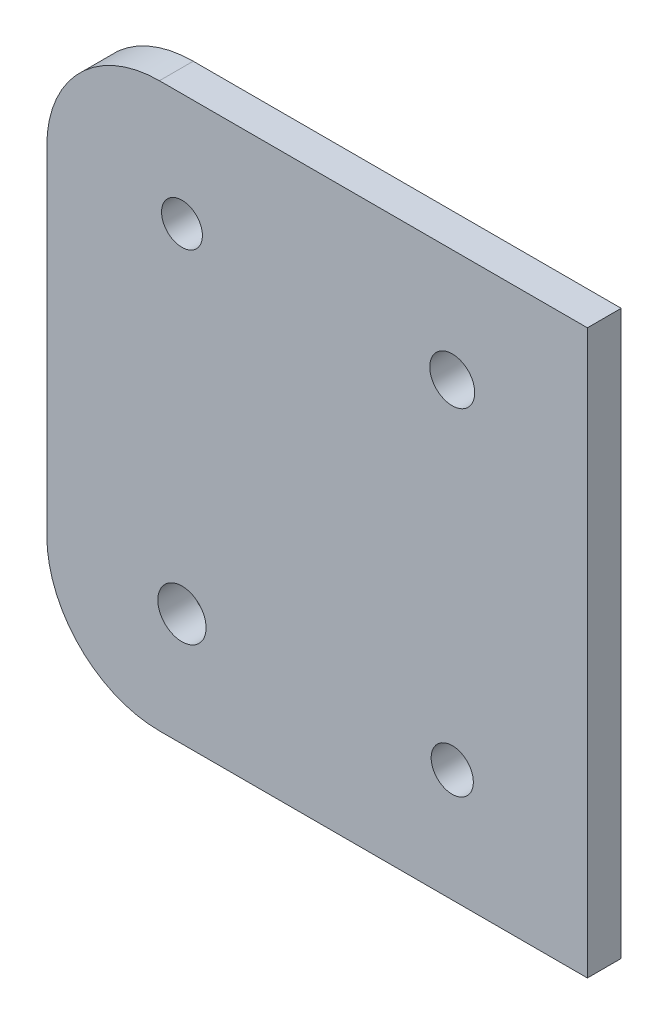
ISO-10303-21;
HEADER;
FILE_DESCRIPTION(('STEP AP214'),'2;1');
FILE_NAME('part.step','',(''),(''),'','','');
FILE_SCHEMA(('AUTOMOTIVE_DESIGN { 1 0 10303 214 1 1 1 1 }'));
ENDSEC;
DATA;
#1=APPLICATION_CONTEXT('core data for automotive mechanical design processes');
#2=APPLICATION_PROTOCOL_DEFINITION('international standard','automotive_design',2000,#1);
#3=PRODUCT_CONTEXT('',#1,'mechanical');
#4=PRODUCT('Part','Part','',(#3));
#5=PRODUCT_RELATED_PRODUCT_CATEGORY('part','',(#4));
#6=PRODUCT_DEFINITION_FORMATION('','',#4);
#7=PRODUCT_DEFINITION_CONTEXT('part definition',#1,'design');
#8=PRODUCT_DEFINITION('design','',#6,#7);
#9=PRODUCT_DEFINITION_SHAPE('','',#8);
#10=(LENGTH_UNIT() NAMED_UNIT(*) SI_UNIT(.MILLI.,.METRE.));
#11=(NAMED_UNIT(*) PLANE_ANGLE_UNIT() SI_UNIT($,.RADIAN.));
#12=(NAMED_UNIT(*) SI_UNIT($,.STERADIAN.) SOLID_ANGLE_UNIT());
#13=UNCERTAINTY_MEASURE_WITH_UNIT(LENGTH_MEASURE(1.E-05),#10,'distance_accuracy_value','');
#14=(GEOMETRIC_REPRESENTATION_CONTEXT(3) GLOBAL_UNCERTAINTY_ASSIGNED_CONTEXT((#13)) GLOBAL_UNIT_ASSIGNED_CONTEXT((#10,
#11,#12)) REPRESENTATION_CONTEXT('',''));
#15=CARTESIAN_POINT('',(0.,0.,0.));
#16=DIRECTION('',(0.,0.,1.));
#17=DIRECTION('',(1.,0.,0.));
#18=AXIS2_PLACEMENT_3D('',#15,#16,#17);
#19=CARTESIAN_POINT('',(-13.3246753246753,-25.3766233766234,3.));
#20=DIRECTION('',(0.,0.,-1.));
#21=DIRECTION('',(-1.,0.,0.));
#22=AXIS2_PLACEMENT_3D('',#19,#20,#21);
#23=PLANE('',#22);
#24=DIRECTION('',(0.,1.,0.));
#25=VECTOR('',#24,1.);
#26=CARTESIAN_POINT('',(24.6753246753247,14.6233766233766,3.));
#27=LINE('',#26,#25);
#28=CARTESIAN_POINT('',(24.6753246753247,-35.3766233766234,3.));
#29=VERTEX_POINT('',#28);
#30=CARTESIAN_POINT('',(24.6753246753247,14.6233766233766,3.));
#31=VERTEX_POINT('',#30);
#32=EDGE_CURVE('E128',#29,#31,#27,.T.);
#33=ORIENTED_EDGE('',*,*,#32,.T.);
#34=DIRECTION('',(-1.,0.,0.));
#35=VECTOR('',#34,1.);
#36=CARTESIAN_POINT('',(-13.3246753246753,14.6233766233766,3.));
#37=LINE('',#36,#35);
#38=CARTESIAN_POINT('',(-13.3246753246753,14.6233766233766,3.));
#39=VERTEX_POINT('',#38);
#40=EDGE_CURVE('E86',#31,#39,#37,.T.);
#41=ORIENTED_EDGE('',*,*,#40,.T.);
#42=CARTESIAN_POINT('',(-13.3246753246753,4.62337662337662,3.));
#43=DIRECTION('',(0.,0.,1.));
#44=DIRECTION('',(-1.,0.,0.));
#45=AXIS2_PLACEMENT_3D('',#42,#43,#44);
#46=CIRCLE('',#45,10.);
#47=CARTESIAN_POINT('',(-23.3246753246753,4.62337662337655,3.));
#48=VERTEX_POINT('',#47);
#49=EDGE_CURVE('E99',#39,#48,#46,.T.);
#50=ORIENTED_EDGE('',*,*,#49,.T.);
#51=DIRECTION('',(0.,-1.,0.));
#52=VECTOR('',#51,1.);
#53=CARTESIAN_POINT('',(-23.3246753246753,4.62337662337655,3.));
#54=LINE('',#53,#52);
#55=CARTESIAN_POINT('',(-23.3246753246753,-25.3766233766234,3.));
#56=VERTEX_POINT('',#55);
#57=EDGE_CURVE('E93',#48,#56,#54,.T.);
#58=ORIENTED_EDGE('',*,*,#57,.T.);
#59=CARTESIAN_POINT('',(-13.3246753246753,-25.3766233766234,3.));
#60=DIRECTION('',(0.,0.,1.));
#61=DIRECTION('',(-1.,0.,0.));
#62=AXIS2_PLACEMENT_3D('',#59,#60,#61);
#63=CIRCLE('',#62,10.);
#64=CARTESIAN_POINT('',(-13.3246753246753,-35.3766233766234,3.));
#65=VERTEX_POINT('',#64);
#66=EDGE_CURVE('E97',#56,#65,#63,.T.);
#67=ORIENTED_EDGE('',*,*,#66,.T.);
#68=DIRECTION('',(1.,0.,0.));
#69=VECTOR('',#68,1.);
#70=CARTESIAN_POINT('',(-13.3246753246753,-35.3766233766234,3.));
#71=LINE('',#70,#69);
#72=EDGE_CURVE('E49',#65,#29,#71,.T.);
#73=ORIENTED_EDGE('',*,*,#72,.T.);
#74=EDGE_LOOP('',(#33,#41,#50,#58,#67,#73));
#75=FACE_BOUND('',#74,.T.);
#76=CARTESIAN_POINT('',(-11.3246753246753,4.62337662337662,3.));
#77=DIRECTION('',(0.,0.,1.));
#78=DIRECTION('',(1.,0.,0.));
#79=AXIS2_PLACEMENT_3D('',#76,#77,#78);
#80=CIRCLE('',#79,1.8144674489946);
#81=CARTESIAN_POINT('',(-9.51020787568073,4.62337662337662,3.));
#82=VERTEX_POINT('',#81);
#83=EDGE_CURVE('E121',#82,#82,#80,.T.);
#84=ORIENTED_EDGE('',*,*,#83,.F.);
#85=EDGE_LOOP('',(#84));
#86=FACE_BOUND('',#85,.T.);
#87=CARTESIAN_POINT('',(12.6753246753247,4.62337662337662,3.));
#88=DIRECTION('',(0.,0.,1.));
#89=DIRECTION('',(1.,0.,0.));
#90=AXIS2_PLACEMENT_3D('',#87,#88,#89);
#91=CIRCLE('',#90,1.99577898309595);
#92=CARTESIAN_POINT('',(14.6711036584206,4.62337662337662,3.));
#93=VERTEX_POINT('',#92);
#94=EDGE_CURVE('E192',#93,#93,#91,.T.);
#95=ORIENTED_EDGE('',*,*,#94,.F.);
#96=EDGE_LOOP('',(#95));
#97=FACE_BOUND('',#96,.T.);
#98=CARTESIAN_POINT('',(-11.3246753246753,-25.3766233766234,3.));
#99=DIRECTION('',(0.,0.,1.));
#100=DIRECTION('',(1.,0.,0.));
#101=AXIS2_PLACEMENT_3D('',#98,#99,#100);
#102=CIRCLE('',#101,2.14187305226892);
#103=CARTESIAN_POINT('',(-9.18280227240641,-25.3766233766234,3.));
#104=VERTEX_POINT('',#103);
#105=EDGE_CURVE('E186',#104,#104,#102,.T.);
#106=ORIENTED_EDGE('',*,*,#105,.F.);
#107=EDGE_LOOP('',(#106));
#108=FACE_BOUND('',#107,.T.);
#109=CARTESIAN_POINT('',(12.6753246753247,-25.3766233766234,3.));
#110=DIRECTION('',(0.,0.,1.));
#111=DIRECTION('',(1.,0.,0.));
#112=AXIS2_PLACEMENT_3D('',#109,#110,#111);
#113=CIRCLE('',#112,1.87301364959167);
#114=CARTESIAN_POINT('',(14.5483383249163,-25.3766233766234,3.));
#115=VERTEX_POINT('',#114);
#116=EDGE_CURVE('E177',#115,#115,#113,.T.);
#117=ORIENTED_EDGE('',*,*,#116,.F.);
#118=EDGE_LOOP('',(#117));
#119=FACE_BOUND('',#118,.T.);
#120=ADVANCED_FACE('F32',(#75,#86,#97,#108,#119),#23,.F.);
#121=CARTESIAN_POINT('',(-13.3246753246753,-25.3766233766234,0.));
#122=DIRECTION('',(0.,0.,-1.));
#123=DIRECTION('',(-1.,0.,0.));
#124=AXIS2_PLACEMENT_3D('',#121,#122,#123);
#125=PLANE('',#124);
#126=CARTESIAN_POINT('',(-11.3246753246753,-25.3766233766234,0.));
#127=DIRECTION('',(0.,0.,1.));
#128=DIRECTION('',(1.,0.,0.));
#129=AXIS2_PLACEMENT_3D('',#126,#127,#128);
#130=CIRCLE('',#129,2.14187305226892);
#131=CARTESIAN_POINT('',(-9.18280227240641,-25.3766233766234,0.));
#132=VERTEX_POINT('',#131);
#133=EDGE_CURVE('E183',#132,#132,#130,.T.);
#134=ORIENTED_EDGE('',*,*,#133,.T.);
#135=EDGE_LOOP('',(#134));
#136=FACE_BOUND('',#135,.T.);
#137=CARTESIAN_POINT('',(-11.3246753246753,4.62337662337662,0.));
#138=DIRECTION('',(0.,0.,1.));
#139=DIRECTION('',(1.,0.,0.));
#140=AXIS2_PLACEMENT_3D('',#137,#138,#139);
#141=CIRCLE('',#140,1.8144674489946);
#142=CARTESIAN_POINT('',(-9.51020787568073,4.62337662337662,0.));
#143=VERTEX_POINT('',#142);
#144=EDGE_CURVE('E195',#143,#143,#141,.T.);
#145=ORIENTED_EDGE('',*,*,#144,.T.);
#146=EDGE_LOOP('',(#145));
#147=FACE_BOUND('',#146,.T.);
#148=DIRECTION('',(0.,1.,0.));
#149=VECTOR('',#148,1.);
#150=CARTESIAN_POINT('',(24.6753246753247,14.6233766233766,0.));
#151=LINE('',#150,#149);
#152=CARTESIAN_POINT('',(24.6753246753247,-35.3766233766234,0.));
#153=VERTEX_POINT('',#152);
#154=CARTESIAN_POINT('',(24.6753246753247,14.6233766233766,0.));
#155=VERTEX_POINT('',#154);
#156=EDGE_CURVE('E117',#153,#155,#151,.T.);
#157=ORIENTED_EDGE('',*,*,#156,.F.);
#158=DIRECTION('',(1.,0.,0.));
#159=VECTOR('',#158,1.);
#160=CARTESIAN_POINT('',(-13.3246753246753,-35.3766233766234,0.));
#161=LINE('',#160,#159);
#162=CARTESIAN_POINT('',(-13.3246753246753,-35.3766233766234,0.));
#163=VERTEX_POINT('',#162);
#164=EDGE_CURVE('E78',#163,#153,#161,.T.);
#165=ORIENTED_EDGE('',*,*,#164,.F.);
#166=CARTESIAN_POINT('',(-13.3246753246753,-25.3766233766234,0.));
#167=DIRECTION('',(0.,0.,1.));
#168=DIRECTION('',(-1.,0.,0.));
#169=AXIS2_PLACEMENT_3D('',#166,#167,#168);
#170=CIRCLE('',#169,10.);
#171=CARTESIAN_POINT('',(-23.3246753246753,-25.3766233766234,0.));
#172=VERTEX_POINT('',#171);
#173=EDGE_CURVE('E72',#172,#163,#170,.T.);
#174=ORIENTED_EDGE('',*,*,#173,.F.);
#175=DIRECTION('',(0.,-1.,0.));
#176=VECTOR('',#175,1.);
#177=CARTESIAN_POINT('',(-23.3246753246753,4.62337662337655,0.));
#178=LINE('',#177,#176);
#179=CARTESIAN_POINT('',(-23.3246753246753,4.62337662337655,0.));
#180=VERTEX_POINT('',#179);
#181=EDGE_CURVE('E107',#180,#172,#178,.T.);
#182=ORIENTED_EDGE('',*,*,#181,.F.);
#183=CARTESIAN_POINT('',(-13.3246753246753,4.62337662337662,0.));
#184=DIRECTION('',(0.,0.,1.));
#185=DIRECTION('',(-1.,0.,0.));
#186=AXIS2_PLACEMENT_3D('',#183,#184,#185);
#187=CIRCLE('',#186,10.);
#188=CARTESIAN_POINT('',(-13.3246753246753,14.6233766233766,0.));
#189=VERTEX_POINT('',#188);
#190=EDGE_CURVE('E123',#189,#180,#187,.T.);
#191=ORIENTED_EDGE('',*,*,#190,.F.);
#192=DIRECTION('',(-1.,0.,0.));
#193=VECTOR('',#192,1.);
#194=CARTESIAN_POINT('',(-13.3246753246753,14.6233766233766,0.));
#195=LINE('',#194,#193);
#196=EDGE_CURVE('E120',#155,#189,#195,.T.);
#197=ORIENTED_EDGE('',*,*,#196,.F.);
#198=EDGE_LOOP('',(#157,#165,#174,#182,#191,#197));
#199=FACE_BOUND('',#198,.T.);
#200=CARTESIAN_POINT('',(12.6753246753247,4.62337662337662,0.));
#201=DIRECTION('',(0.,0.,1.));
#202=DIRECTION('',(1.,0.,0.));
#203=AXIS2_PLACEMENT_3D('',#200,#201,#202);
#204=CIRCLE('',#203,1.99577898309595);
#205=CARTESIAN_POINT('',(14.6711036584206,4.62337662337662,0.));
#206=VERTEX_POINT('',#205);
#207=EDGE_CURVE('E189',#206,#206,#204,.T.);
#208=ORIENTED_EDGE('',*,*,#207,.T.);
#209=EDGE_LOOP('',(#208));
#210=FACE_BOUND('',#209,.T.);
#211=CARTESIAN_POINT('',(12.6753246753247,-25.3766233766234,0.));
#212=DIRECTION('',(0.,0.,1.));
#213=DIRECTION('',(1.,0.,0.));
#214=AXIS2_PLACEMENT_3D('',#211,#212,#213);
#215=CIRCLE('',#214,1.87301364959167);
#216=CARTESIAN_POINT('',(14.5483383249163,-25.3766233766234,0.));
#217=VERTEX_POINT('',#216);
#218=EDGE_CURVE('E180',#217,#217,#215,.T.);
#219=ORIENTED_EDGE('',*,*,#218,.T.);
#220=EDGE_LOOP('',(#219));
#221=FACE_BOUND('',#220,.T.);
#222=ADVANCED_FACE('F137',(#136,#147,#199,#210,#221),#125,.T.);
#223=CARTESIAN_POINT('',(24.6753246753247,14.6233766233766,3.));
#224=DIRECTION('',(-1.,0.,0.));
#225=DIRECTION('',(0.,-1.,0.));
#226=AXIS2_PLACEMENT_3D('',#223,#224,#225);
#227=PLANE('',#226);
#228=ORIENTED_EDGE('',*,*,#156,.T.);
#229=DIRECTION('',(0.,0.,-1.));
#230=VECTOR('',#229,1.);
#231=CARTESIAN_POINT('',(24.6753246753247,14.6233766233766,3.));
#232=LINE('',#231,#230);
#233=EDGE_CURVE('E11',#31,#155,#232,.T.);
#234=ORIENTED_EDGE('',*,*,#233,.F.);
#235=ORIENTED_EDGE('',*,*,#32,.F.);
#236=DIRECTION('',(0.,0.,-1.));
#237=VECTOR('',#236,1.);
#238=CARTESIAN_POINT('',(24.6753246753247,-35.3766233766234,3.));
#239=LINE('',#238,#237);
#240=EDGE_CURVE('E113',#29,#153,#239,.T.);
#241=ORIENTED_EDGE('',*,*,#240,.T.);
#242=EDGE_LOOP('',(#228,#234,#235,#241));
#243=FACE_BOUND('',#242,.T.);
#244=ADVANCED_FACE('F34',(#243),#227,.F.);
#245=CARTESIAN_POINT('',(-13.3246753246753,14.6233766233766,3.));
#246=DIRECTION('',(0.,-1.,0.));
#247=DIRECTION('',(0.,0.,-1.));
#248=AXIS2_PLACEMENT_3D('',#245,#246,#247);
#249=PLANE('',#248);
#250=ORIENTED_EDGE('',*,*,#196,.T.);
#251=DIRECTION('',(0.,0.,-1.));
#252=VECTOR('',#251,1.);
#253=CARTESIAN_POINT('',(-13.3246753246753,14.6233766233766,3.));
#254=LINE('',#253,#252);
#255=EDGE_CURVE('E41',#39,#189,#254,.T.);
#256=ORIENTED_EDGE('',*,*,#255,.F.);
#257=ORIENTED_EDGE('',*,*,#40,.F.);
#258=ORIENTED_EDGE('',*,*,#233,.T.);
#259=EDGE_LOOP('',(#250,#256,#257,#258));
#260=FACE_BOUND('',#259,.T.);
#261=ADVANCED_FACE('F255',(#260),#249,.F.);
#262=CARTESIAN_POINT('',(-13.3246753246753,4.62337662337662,3.));
#263=DIRECTION('',(0.,0.,-1.));
#264=DIRECTION('',(-1.,0.,0.));
#265=AXIS2_PLACEMENT_3D('',#262,#263,#264);
#266=CYLINDRICAL_SURFACE('',#265,10.);
#267=ORIENTED_EDGE('',*,*,#190,.T.);
#268=DIRECTION('',(0.,0.,-1.));
#269=VECTOR('',#268,1.);
#270=CARTESIAN_POINT('',(-23.3246753246753,4.62337662337655,3.));
#271=LINE('',#270,#269);
#272=EDGE_CURVE('E108',#48,#180,#271,.T.);
#273=ORIENTED_EDGE('',*,*,#272,.F.);
#274=ORIENTED_EDGE('',*,*,#49,.F.);
#275=ORIENTED_EDGE('',*,*,#255,.T.);
#276=EDGE_LOOP('',(#267,#273,#274,#275));
#277=FACE_BOUND('',#276,.T.);
#278=ADVANCED_FACE('F134',(#277),#266,.T.);
#279=CARTESIAN_POINT('',(-23.3246753246753,4.62337662337655,3.));
#280=DIRECTION('',(1.,0.,0.));
#281=DIRECTION('',(0.,1.,0.));
#282=AXIS2_PLACEMENT_3D('',#279,#280,#281);
#283=PLANE('',#282);
#284=ORIENTED_EDGE('',*,*,#181,.T.);
#285=DIRECTION('',(0.,0.,-1.));
#286=VECTOR('',#285,1.);
#287=CARTESIAN_POINT('',(-23.3246753246753,-25.3766233766234,3.));
#288=LINE('',#287,#286);
#289=EDGE_CURVE('E104',#56,#172,#288,.T.);
#290=ORIENTED_EDGE('',*,*,#289,.F.);
#291=ORIENTED_EDGE('',*,*,#57,.F.);
#292=ORIENTED_EDGE('',*,*,#272,.T.);
#293=EDGE_LOOP('',(#284,#290,#291,#292));
#294=FACE_BOUND('',#293,.T.);
#295=ADVANCED_FACE('F105',(#294),#283,.F.);
#296=CARTESIAN_POINT('',(-13.3246753246753,-25.3766233766234,3.));
#297=DIRECTION('',(0.,0.,-1.));
#298=DIRECTION('',(-1.,0.,0.));
#299=AXIS2_PLACEMENT_3D('',#296,#297,#298);
#300=CYLINDRICAL_SURFACE('',#299,10.);
#301=ORIENTED_EDGE('',*,*,#173,.T.);
#302=DIRECTION('',(0.,0.,-1.));
#303=VECTOR('',#302,1.);
#304=CARTESIAN_POINT('',(-13.3246753246753,-35.3766233766234,3.));
#305=LINE('',#304,#303);
#306=EDGE_CURVE('E109',#65,#163,#305,.T.);
#307=ORIENTED_EDGE('',*,*,#306,.F.);
#308=ORIENTED_EDGE('',*,*,#66,.F.);
#309=ORIENTED_EDGE('',*,*,#289,.T.);
#310=EDGE_LOOP('',(#301,#307,#308,#309));
#311=FACE_BOUND('',#310,.T.);
#312=ADVANCED_FACE('F111',(#311),#300,.T.);
#313=CARTESIAN_POINT('',(-13.3246753246753,-35.3766233766234,3.));
#314=DIRECTION('',(0.,1.,0.));
#315=DIRECTION('',(0.,0.,1.));
#316=AXIS2_PLACEMENT_3D('',#313,#314,#315);
#317=PLANE('',#316);
#318=ORIENTED_EDGE('',*,*,#164,.T.);
#319=ORIENTED_EDGE('',*,*,#240,.F.);
#320=ORIENTED_EDGE('',*,*,#72,.F.);
#321=ORIENTED_EDGE('',*,*,#306,.T.);
#322=EDGE_LOOP('',(#318,#319,#320,#321));
#323=FACE_BOUND('',#322,.T.);
#324=ADVANCED_FACE('F142',(#323),#317,.F.);
#325=CARTESIAN_POINT('',(-11.3246753246753,4.62337662337662,3.));
#326=DIRECTION('',(0.,0.,-1.));
#327=DIRECTION('',(-1.,0.,0.));
#328=AXIS2_PLACEMENT_3D('',#325,#326,#327);
#329=CYLINDRICAL_SURFACE('',#328,1.8144674489946);
#330=ORIENTED_EDGE('',*,*,#83,.T.);
#331=EDGE_LOOP('',(#330));
#332=FACE_BOUND('',#331,.T.);
#333=ORIENTED_EDGE('',*,*,#144,.F.);
#334=EDGE_LOOP('',(#333));
#335=FACE_BOUND('',#334,.T.);
#336=ADVANCED_FACE('F144',(#332,#335),#329,.F.);
#337=CARTESIAN_POINT('',(12.6753246753247,4.62337662337662,3.));
#338=DIRECTION('',(0.,0.,-1.));
#339=DIRECTION('',(-1.,0.,0.));
#340=AXIS2_PLACEMENT_3D('',#337,#338,#339);
#341=CYLINDRICAL_SURFACE('',#340,1.99577898309595);
#342=ORIENTED_EDGE('',*,*,#94,.T.);
#343=EDGE_LOOP('',(#342));
#344=FACE_BOUND('',#343,.T.);
#345=ORIENTED_EDGE('',*,*,#207,.F.);
#346=EDGE_LOOP('',(#345));
#347=FACE_BOUND('',#346,.T.);
#348=ADVANCED_FACE('F150',(#344,#347),#341,.F.);
#349=CARTESIAN_POINT('',(-11.3246753246753,-25.3766233766234,3.));
#350=DIRECTION('',(0.,0.,-1.));
#351=DIRECTION('',(-1.,0.,0.));
#352=AXIS2_PLACEMENT_3D('',#349,#350,#351);
#353=CYLINDRICAL_SURFACE('',#352,2.14187305226892);
#354=ORIENTED_EDGE('',*,*,#105,.T.);
#355=EDGE_LOOP('',(#354));
#356=FACE_BOUND('',#355,.T.);
#357=ORIENTED_EDGE('',*,*,#133,.F.);
#358=EDGE_LOOP('',(#357));
#359=FACE_BOUND('',#358,.T.);
#360=ADVANCED_FACE('F164',(#356,#359),#353,.F.);
#361=CARTESIAN_POINT('',(12.6753246753247,-25.3766233766234,3.));
#362=DIRECTION('',(0.,0.,-1.));
#363=DIRECTION('',(-1.,0.,0.));
#364=AXIS2_PLACEMENT_3D('',#361,#362,#363);
#365=CYLINDRICAL_SURFACE('',#364,1.87301364959167);
#366=ORIENTED_EDGE('',*,*,#116,.T.);
#367=EDGE_LOOP('',(#366));
#368=FACE_BOUND('',#367,.T.);
#369=ORIENTED_EDGE('',*,*,#218,.F.);
#370=EDGE_LOOP('',(#369));
#371=FACE_BOUND('',#370,.T.);
#372=ADVANCED_FACE('F168',(#368,#371),#365,.F.);
#373=CLOSED_SHELL('',(#120,#222,#244,#261,#278,#295,#312,#324,#336,#348,#360,#372));
#374=MANIFOLD_SOLID_BREP('B2',#373);
#375=ADVANCED_BREP_SHAPE_REPRESENTATION('',(#18,#374),#14);
#376=SHAPE_DEFINITION_REPRESENTATION(#9,#375);
ENDSEC;
END-ISO-10303-21;
